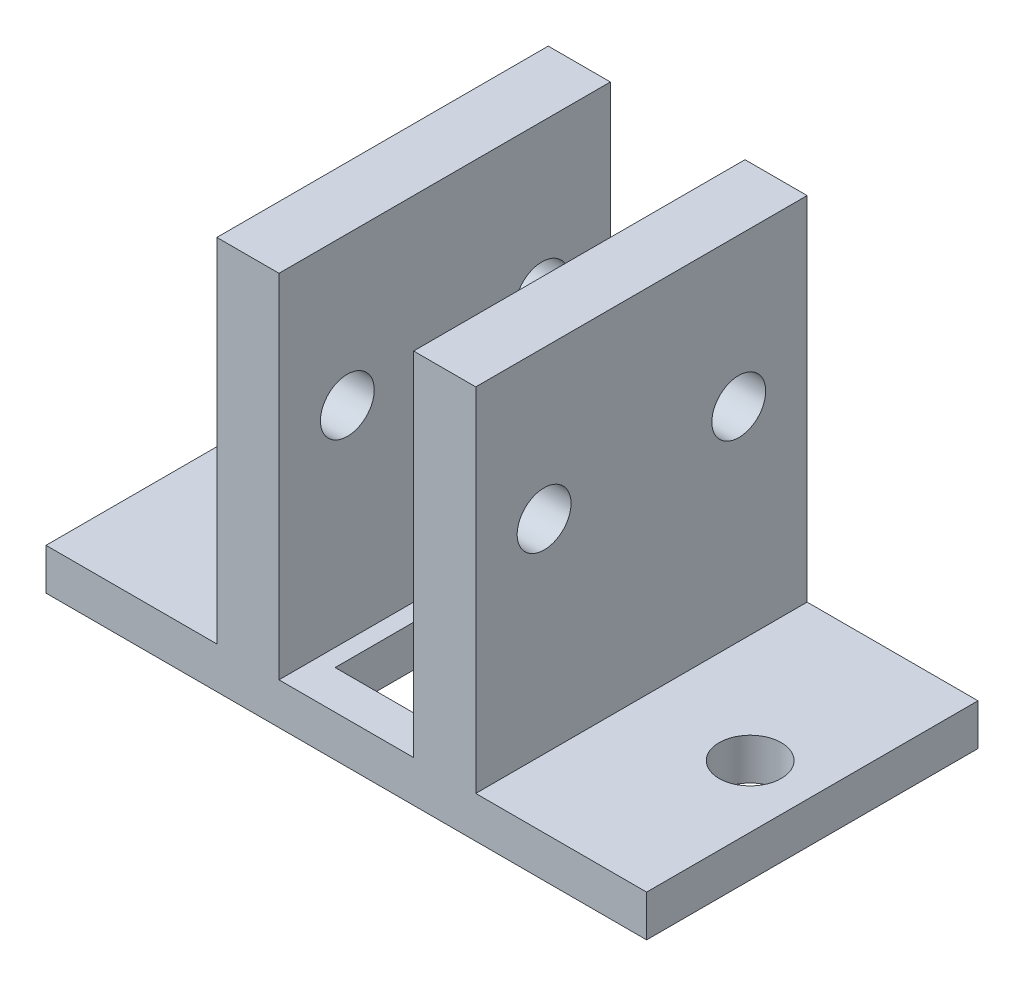
ISO-10303-21;
HEADER;
FILE_DESCRIPTION(('STEP AP214'),'2;1');
FILE_NAME('part.step','',(''),(''),'','','');
FILE_SCHEMA(('AUTOMOTIVE_DESIGN { 1 0 10303 214 1 1 1 1 }'));
ENDSEC;
DATA;
#1=APPLICATION_CONTEXT('core data for automotive mechanical design processes');
#2=APPLICATION_PROTOCOL_DEFINITION('international standard','automotive_design',2000,#1);
#3=PRODUCT_CONTEXT('',#1,'mechanical');
#4=PRODUCT('Part','Part','',(#3));
#5=PRODUCT_RELATED_PRODUCT_CATEGORY('part','',(#4));
#6=PRODUCT_DEFINITION_FORMATION('','',#4);
#7=PRODUCT_DEFINITION_CONTEXT('part definition',#1,'design');
#8=PRODUCT_DEFINITION('design','',#6,#7);
#9=PRODUCT_DEFINITION_SHAPE('','',#8);
#10=(LENGTH_UNIT() NAMED_UNIT(*) SI_UNIT(.MILLI.,.METRE.));
#11=(NAMED_UNIT(*) PLANE_ANGLE_UNIT() SI_UNIT($,.RADIAN.));
#12=(NAMED_UNIT(*) SI_UNIT($,.STERADIAN.) SOLID_ANGLE_UNIT());
#13=UNCERTAINTY_MEASURE_WITH_UNIT(LENGTH_MEASURE(1.E-05),#10,'distance_accuracy_value','');
#14=(GEOMETRIC_REPRESENTATION_CONTEXT(3) GLOBAL_UNCERTAINTY_ASSIGNED_CONTEXT((#13)) GLOBAL_UNIT_ASSIGNED_CONTEXT((#10,
#11,#12)) REPRESENTATION_CONTEXT('',''));
#15=CARTESIAN_POINT('',(0.,0.,0.));
#16=DIRECTION('',(0.,0.,1.));
#17=DIRECTION('',(1.,0.,0.));
#18=AXIS2_PLACEMENT_3D('',#15,#16,#17);
#19=CARTESIAN_POINT('',(0.,2.,0.));
#20=DIRECTION('',(0.,1.,0.));
#21=DIRECTION('',(0.,0.,1.));
#22=AXIS2_PLACEMENT_3D('',#19,#20,#21);
#23=PLANE('',#22);
#24=CARTESIAN_POINT('',(11.5,2.,0.));
#25=DIRECTION('',(0.,1.,0.));
#26=DIRECTION('',(0.,0.,1.));
#27=AXIS2_PLACEMENT_3D('',#24,#25,#26);
#28=CIRCLE('',#27,1.5);
#29=CARTESIAN_POINT('',(11.5,2.,1.5));
#30=VERTEX_POINT('',#29);
#31=EDGE_CURVE('E261',#30,#30,#28,.T.);
#32=ORIENTED_EDGE('',*,*,#31,.F.);
#33=EDGE_LOOP('',(#32));
#34=FACE_BOUND('',#33,.T.);
#35=DIRECTION('',(-1.,0.,0.));
#36=VECTOR('',#35,1.);
#37=CARTESIAN_POINT('',(14.5,2.,-8.));
#38=LINE('',#37,#36);
#39=CARTESIAN_POINT('',(14.5,2.,-8.));
#40=VERTEX_POINT('',#39);
#41=CARTESIAN_POINT('',(6.25000000000001,2.,-8.));
#42=VERTEX_POINT('',#41);
#43=EDGE_CURVE('E278',#40,#42,#38,.T.);
#44=ORIENTED_EDGE('',*,*,#43,.T.);
#45=DIRECTION('',(0.,0.,-1.));
#46=VECTOR('',#45,1.);
#47=CARTESIAN_POINT('',(6.25,2.,8.00000000000002));
#48=LINE('',#47,#46);
#49=CARTESIAN_POINT('',(6.25,2.,8.));
#50=VERTEX_POINT('',#49);
#51=EDGE_CURVE('E216',#50,#42,#48,.T.);
#52=ORIENTED_EDGE('',*,*,#51,.F.);
#53=DIRECTION('',(1.,0.,0.));
#54=VECTOR('',#53,1.);
#55=CARTESIAN_POINT('',(-14.5,2.,8.));
#56=LINE('',#55,#54);
#57=CARTESIAN_POINT('',(14.5,2.,8.));
#58=VERTEX_POINT('',#57);
#59=EDGE_CURVE('E270',#50,#58,#56,.T.);
#60=ORIENTED_EDGE('',*,*,#59,.T.);
#61=DIRECTION('',(0.,0.,-1.));
#62=VECTOR('',#61,1.);
#63=CARTESIAN_POINT('',(14.5,2.,8.));
#64=LINE('',#63,#62);
#65=EDGE_CURVE('E274',#58,#40,#64,.T.);
#66=ORIENTED_EDGE('',*,*,#65,.T.);
#67=EDGE_LOOP('',(#44,#52,#60,#66));
#68=FACE_BOUND('',#67,.T.);
#69=ADVANCED_FACE('F39',(#34,#68),#23,.T.);
#70=DIRECTION('',(0.,0.,1.));
#71=VECTOR('',#70,1.);
#72=CARTESIAN_POINT('',(-2.40923405016645,2.,6.13119178151331));
#73=LINE('',#72,#71);
#74=CARTESIAN_POINT('',(-2.40923405016645,2.,-6.13119178151331));
#75=VERTEX_POINT('',#74);
#76=CARTESIAN_POINT('',(-2.40923405016645,2.,6.13119178151331));
#77=VERTEX_POINT('',#76);
#78=EDGE_CURVE('E54',#75,#77,#73,.T.);
#79=ORIENTED_EDGE('',*,*,#78,.F.);
#80=DIRECTION('',(-1.,0.,0.));
#81=VECTOR('',#80,1.);
#82=CARTESIAN_POINT('',(2.40923405016645,2.,-6.13119178151331));
#83=LINE('',#82,#81);
#84=CARTESIAN_POINT('',(2.40923405016645,2.,-6.13119178151331));
#85=VERTEX_POINT('',#84);
#86=EDGE_CURVE('E171',#85,#75,#83,.T.);
#87=ORIENTED_EDGE('',*,*,#86,.F.);
#88=DIRECTION('',(0.,0.,-1.));
#89=VECTOR('',#88,1.);
#90=CARTESIAN_POINT('',(2.40923405016645,2.,6.13119178151331));
#91=LINE('',#90,#89);
#92=CARTESIAN_POINT('',(2.40923405016645,2.,6.13119178151331));
#93=VERTEX_POINT('',#92);
#94=EDGE_CURVE('E155',#93,#85,#91,.T.);
#95=ORIENTED_EDGE('',*,*,#94,.F.);
#96=DIRECTION('',(1.,0.,0.));
#97=VECTOR('',#96,1.);
#98=CARTESIAN_POINT('',(2.40923405016645,2.,6.13119178151331));
#99=LINE('',#98,#97);
#100=EDGE_CURVE('E164',#77,#93,#99,.T.);
#101=ORIENTED_EDGE('',*,*,#100,.F.);
#102=EDGE_LOOP('',(#79,#87,#95,#101));
#103=FACE_BOUND('',#102,.T.);
#104=CARTESIAN_POINT('',(-3.25,2.,8.));
#105=VERTEX_POINT('',#104);
#106=CARTESIAN_POINT('',(3.25,2.,8.));
#107=VERTEX_POINT('',#106);
#108=EDGE_CURVE('E275',#105,#107,#56,.T.);
#109=ORIENTED_EDGE('',*,*,#108,.T.);
#110=DIRECTION('',(0.,0.,1.));
#111=VECTOR('',#110,1.);
#112=CARTESIAN_POINT('',(3.25,2.,-8.00000000000002));
#113=LINE('',#112,#111);
#114=CARTESIAN_POINT('',(3.25,2.,-8.00000000000002));
#115=VERTEX_POINT('',#114);
#116=EDGE_CURVE('E213',#115,#107,#113,.T.);
#117=ORIENTED_EDGE('',*,*,#116,.F.);
#118=CARTESIAN_POINT('',(-3.25,2.,-8.));
#119=VERTEX_POINT('',#118);
#120=EDGE_CURVE('E281',#115,#119,#38,.T.);
#121=ORIENTED_EDGE('',*,*,#120,.T.);
#122=DIRECTION('',(0.,0.,-1.));
#123=VECTOR('',#122,1.);
#124=CARTESIAN_POINT('',(-3.25,2.,-8.00000000000002));
#125=LINE('',#124,#123);
#126=EDGE_CURVE('E232',#105,#119,#125,.T.);
#127=ORIENTED_EDGE('',*,*,#126,.F.);
#128=EDGE_LOOP('',(#109,#117,#121,#127));
#129=FACE_BOUND('',#128,.T.);
#130=ADVANCED_FACE('F168',(#103,#129),#23,.T.);
#131=DIRECTION('',(0.,0.,1.));
#132=VECTOR('',#131,1.);
#133=CARTESIAN_POINT('',(-6.25,2.,8.00000000000002));
#134=LINE('',#133,#132);
#135=CARTESIAN_POINT('',(-6.25,2.,-8.));
#136=VERTEX_POINT('',#135);
#137=CARTESIAN_POINT('',(-6.25,2.,8.00000000000002));
#138=VERTEX_POINT('',#137);
#139=EDGE_CURVE('E220',#136,#138,#134,.T.);
#140=ORIENTED_EDGE('',*,*,#139,.F.);
#141=CARTESIAN_POINT('',(-14.5,2.,-8.));
#142=VERTEX_POINT('',#141);
#143=EDGE_CURVE('E277',#136,#142,#38,.T.);
#144=ORIENTED_EDGE('',*,*,#143,.T.);
#145=DIRECTION('',(0.,0.,1.));
#146=VECTOR('',#145,1.);
#147=CARTESIAN_POINT('',(-14.5,2.,8.));
#148=LINE('',#147,#146);
#149=CARTESIAN_POINT('',(-14.5,2.,8.));
#150=VERTEX_POINT('',#149);
#151=EDGE_CURVE('E267',#142,#150,#148,.T.);
#152=ORIENTED_EDGE('',*,*,#151,.T.);
#153=EDGE_CURVE('E272',#150,#138,#56,.T.);
#154=ORIENTED_EDGE('',*,*,#153,.T.);
#155=EDGE_LOOP('',(#140,#144,#152,#154));
#156=FACE_BOUND('',#155,.T.);
#157=CARTESIAN_POINT('',(-11.5,2.,0.));
#158=DIRECTION('',(0.,1.,0.));
#159=DIRECTION('',(0.,0.,-1.));
#160=AXIS2_PLACEMENT_3D('',#157,#158,#159);
#161=CIRCLE('',#160,1.5);
#162=CARTESIAN_POINT('',(-11.5,2.,-1.5));
#163=VERTEX_POINT('',#162);
#164=EDGE_CURVE('E255',#163,#163,#161,.T.);
#165=ORIENTED_EDGE('',*,*,#164,.F.);
#166=EDGE_LOOP('',(#165));
#167=FACE_BOUND('',#166,.T.);
#168=ADVANCED_FACE('F331',(#156,#167),#23,.T.);
#169=CARTESIAN_POINT('',(0.,0.,0.));
#170=DIRECTION('',(0.,1.,0.));
#171=DIRECTION('',(0.,0.,1.));
#172=AXIS2_PLACEMENT_3D('',#169,#170,#171);
#173=PLANE('',#172);
#174=DIRECTION('',(-1.,0.,0.));
#175=VECTOR('',#174,1.);
#176=CARTESIAN_POINT('',(0.,0.,-6.13119178151331));
#177=LINE('',#176,#175);
#178=CARTESIAN_POINT('',(2.40923405016645,0.,-6.13119178151331));
#179=VERTEX_POINT('',#178);
#180=CARTESIAN_POINT('',(-2.40923405016645,0.,-6.13119178151331));
#181=VERTEX_POINT('',#180);
#182=EDGE_CURVE('E47',#179,#181,#177,.T.);
#183=ORIENTED_EDGE('',*,*,#182,.T.);
#184=DIRECTION('',(0.,0.,1.));
#185=VECTOR('',#184,1.);
#186=CARTESIAN_POINT('',(-2.40923405016645,0.,0.));
#187=LINE('',#186,#185);
#188=CARTESIAN_POINT('',(-2.40923405016645,0.,6.13119178151331));
#189=VERTEX_POINT('',#188);
#190=EDGE_CURVE('E11',#181,#189,#187,.T.);
#191=ORIENTED_EDGE('',*,*,#190,.T.);
#192=DIRECTION('',(1.,0.,0.));
#193=VECTOR('',#192,1.);
#194=CARTESIAN_POINT('',(0.,0.,6.13119178151331));
#195=LINE('',#194,#193);
#196=CARTESIAN_POINT('',(2.40923405016645,0.,6.13119178151331));
#197=VERTEX_POINT('',#196);
#198=EDGE_CURVE('E300',#189,#197,#195,.T.);
#199=ORIENTED_EDGE('',*,*,#198,.T.);
#200=DIRECTION('',(0.,0.,-1.));
#201=VECTOR('',#200,1.);
#202=CARTESIAN_POINT('',(2.40923405016645,0.,0.));
#203=LINE('',#202,#201);
#204=EDGE_CURVE('E158',#197,#179,#203,.T.);
#205=ORIENTED_EDGE('',*,*,#204,.T.);
#206=EDGE_LOOP('',(#183,#191,#199,#205));
#207=FACE_BOUND('',#206,.T.);
#208=DIRECTION('',(0.,0.,1.));
#209=VECTOR('',#208,1.);
#210=CARTESIAN_POINT('',(-14.5,0.,8.));
#211=LINE('',#210,#209);
#212=CARTESIAN_POINT('',(-14.5,0.,-8.));
#213=VERTEX_POINT('',#212);
#214=CARTESIAN_POINT('',(-14.5,0.,8.));
#215=VERTEX_POINT('',#214);
#216=EDGE_CURVE('E264',#213,#215,#211,.T.);
#217=ORIENTED_EDGE('',*,*,#216,.F.);
#218=DIRECTION('',(-1.,0.,0.));
#219=VECTOR('',#218,1.);
#220=CARTESIAN_POINT('',(14.5,0.,-8.));
#221=LINE('',#220,#219);
#222=CARTESIAN_POINT('',(14.5,0.,-8.));
#223=VERTEX_POINT('',#222);
#224=EDGE_CURVE('E271',#223,#213,#221,.T.);
#225=ORIENTED_EDGE('',*,*,#224,.F.);
#226=DIRECTION('',(0.,0.,-1.));
#227=VECTOR('',#226,1.);
#228=CARTESIAN_POINT('',(14.5,0.,8.));
#229=LINE('',#228,#227);
#230=CARTESIAN_POINT('',(14.5,0.,8.));
#231=VERTEX_POINT('',#230);
#232=EDGE_CURVE('E286',#231,#223,#229,.T.);
#233=ORIENTED_EDGE('',*,*,#232,.F.);
#234=DIRECTION('',(1.,0.,0.));
#235=VECTOR('',#234,1.);
#236=CARTESIAN_POINT('',(-14.5,0.,8.));
#237=LINE('',#236,#235);
#238=EDGE_CURVE('E284',#215,#231,#237,.T.);
#239=ORIENTED_EDGE('',*,*,#238,.F.);
#240=EDGE_LOOP('',(#217,#225,#233,#239));
#241=FACE_BOUND('',#240,.T.);
#242=CARTESIAN_POINT('',(11.5,0.,0.));
#243=DIRECTION('',(0.,1.,0.));
#244=DIRECTION('',(0.,0.,1.));
#245=AXIS2_PLACEMENT_3D('',#242,#243,#244);
#246=CIRCLE('',#245,1.5);
#247=CARTESIAN_POINT('',(11.5,0.,1.5));
#248=VERTEX_POINT('',#247);
#249=EDGE_CURVE('E258',#248,#248,#246,.T.);
#250=ORIENTED_EDGE('',*,*,#249,.T.);
#251=EDGE_LOOP('',(#250));
#252=FACE_BOUND('',#251,.T.);
#253=CARTESIAN_POINT('',(-11.5,0.,0.));
#254=DIRECTION('',(0.,1.,0.));
#255=DIRECTION('',(0.,0.,-1.));
#256=AXIS2_PLACEMENT_3D('',#253,#254,#255);
#257=CIRCLE('',#256,1.5);
#258=CARTESIAN_POINT('',(-11.5,0.,-1.5));
#259=VERTEX_POINT('',#258);
#260=EDGE_CURVE('E254',#259,#259,#257,.T.);
#261=ORIENTED_EDGE('',*,*,#260,.T.);
#262=EDGE_LOOP('',(#261));
#263=FACE_BOUND('',#262,.T.);
#264=ADVANCED_FACE('F308',(#207,#241,#252,#263),#173,.F.);
#265=CARTESIAN_POINT('',(-14.5,2.,8.));
#266=DIRECTION('',(1.,0.,0.));
#267=DIRECTION('',(0.,0.,-1.));
#268=AXIS2_PLACEMENT_3D('',#265,#266,#267);
#269=PLANE('',#268);
#270=ORIENTED_EDGE('',*,*,#216,.T.);
#271=DIRECTION('',(0.,-1.,0.));
#272=VECTOR('',#271,1.);
#273=CARTESIAN_POINT('',(-14.5,2.,8.));
#274=LINE('',#273,#272);
#275=EDGE_CURVE('E297',#150,#215,#274,.T.);
#276=ORIENTED_EDGE('',*,*,#275,.F.);
#277=ORIENTED_EDGE('',*,*,#151,.F.);
#278=DIRECTION('',(0.,-1.,0.));
#279=VECTOR('',#278,1.);
#280=CARTESIAN_POINT('',(-14.5,2.,-8.));
#281=LINE('',#280,#279);
#282=EDGE_CURVE('E280',#142,#213,#281,.T.);
#283=ORIENTED_EDGE('',*,*,#282,.T.);
#284=EDGE_LOOP('',(#270,#276,#277,#283));
#285=FACE_BOUND('',#284,.T.);
#286=ADVANCED_FACE('F41',(#285),#269,.F.);
#287=CARTESIAN_POINT('',(-14.5,2.,8.));
#288=DIRECTION('',(0.,0.,-1.));
#289=DIRECTION('',(-1.,0.,0.));
#290=AXIS2_PLACEMENT_3D('',#287,#288,#289);
#291=PLANE('',#290);
#292=ORIENTED_EDGE('',*,*,#238,.T.);
#293=DIRECTION('',(0.,-1.,0.));
#294=VECTOR('',#293,1.);
#295=CARTESIAN_POINT('',(14.5,2.,8.));
#296=LINE('',#295,#294);
#297=EDGE_CURVE('E294',#58,#231,#296,.T.);
#298=ORIENTED_EDGE('',*,*,#297,.F.);
#299=ORIENTED_EDGE('',*,*,#59,.F.);
#300=DIRECTION('',(0.,-1.,0.));
#301=VECTOR('',#300,1.);
#302=CARTESIAN_POINT('',(6.25,19.,8.00000000000002));
#303=LINE('',#302,#301);
#304=CARTESIAN_POINT('',(6.25,19.,8.00000000000002));
#305=VERTEX_POINT('',#304);
#306=EDGE_CURVE('E200',#305,#50,#303,.T.);
#307=ORIENTED_EDGE('',*,*,#306,.F.);
#308=DIRECTION('',(1.,0.,0.));
#309=VECTOR('',#308,1.);
#310=CARTESIAN_POINT('',(3.25,19.,8.));
#311=LINE('',#310,#309);
#312=CARTESIAN_POINT('',(3.25,19.,8.));
#313=VERTEX_POINT('',#312);
#314=EDGE_CURVE('E217',#313,#305,#311,.T.);
#315=ORIENTED_EDGE('',*,*,#314,.F.);
#316=DIRECTION('',(0.,-1.,0.));
#317=VECTOR('',#316,1.);
#318=CARTESIAN_POINT('',(3.25,19.,8.));
#319=LINE('',#318,#317);
#320=EDGE_CURVE('E209',#313,#107,#319,.T.);
#321=ORIENTED_EDGE('',*,*,#320,.T.);
#322=ORIENTED_EDGE('',*,*,#108,.F.);
#323=DIRECTION('',(0.,-1.,0.));
#324=VECTOR('',#323,1.);
#325=CARTESIAN_POINT('',(-3.25,19.,8.));
#326=LINE('',#325,#324);
#327=CARTESIAN_POINT('',(-3.25,19.,8.));
#328=VERTEX_POINT('',#327);
#329=EDGE_CURVE('E245',#328,#105,#326,.T.);
#330=ORIENTED_EDGE('',*,*,#329,.F.);
#331=DIRECTION('',(1.,0.,0.));
#332=VECTOR('',#331,1.);
#333=CARTESIAN_POINT('',(-3.25,19.,8.));
#334=LINE('',#333,#332);
#335=CARTESIAN_POINT('',(-6.25,19.,8.00000000000002));
#336=VERTEX_POINT('',#335);
#337=EDGE_CURVE('E234',#336,#328,#334,.T.);
#338=ORIENTED_EDGE('',*,*,#337,.F.);
#339=DIRECTION('',(0.,-1.,0.));
#340=VECTOR('',#339,1.);
#341=CARTESIAN_POINT('',(-6.25,19.,8.00000000000002));
#342=LINE('',#341,#340);
#343=EDGE_CURVE('E248',#336,#138,#342,.T.);
#344=ORIENTED_EDGE('',*,*,#343,.T.);
#345=ORIENTED_EDGE('',*,*,#153,.F.);
#346=ORIENTED_EDGE('',*,*,#275,.T.);
#347=EDGE_LOOP('',(#292,#298,#299,#307,#315,#321,#322,#330,#338,#344,#345,#346));
#348=FACE_BOUND('',#347,.T.);
#349=ADVANCED_FACE('F410',(#348),#291,.F.);
#350=CARTESIAN_POINT('',(14.5,2.,8.));
#351=DIRECTION('',(-1.,0.,0.));
#352=DIRECTION('',(0.,0.,1.));
#353=AXIS2_PLACEMENT_3D('',#350,#351,#352);
#354=PLANE('',#353);
#355=ORIENTED_EDGE('',*,*,#232,.T.);
#356=DIRECTION('',(0.,-1.,0.));
#357=VECTOR('',#356,1.);
#358=CARTESIAN_POINT('',(14.5,2.,-8.));
#359=LINE('',#358,#357);
#360=EDGE_CURVE('E291',#40,#223,#359,.T.);
#361=ORIENTED_EDGE('',*,*,#360,.F.);
#362=ORIENTED_EDGE('',*,*,#65,.F.);
#363=ORIENTED_EDGE('',*,*,#297,.T.);
#364=EDGE_LOOP('',(#355,#361,#362,#363));
#365=FACE_BOUND('',#364,.T.);
#366=ADVANCED_FACE('F436',(#365),#354,.F.);
#367=CARTESIAN_POINT('',(14.5,2.,-8.));
#368=DIRECTION('',(0.,0.,1.));
#369=DIRECTION('',(1.,0.,0.));
#370=AXIS2_PLACEMENT_3D('',#367,#368,#369);
#371=PLANE('',#370);
#372=ORIENTED_EDGE('',*,*,#224,.T.);
#373=ORIENTED_EDGE('',*,*,#282,.F.);
#374=ORIENTED_EDGE('',*,*,#143,.F.);
#375=DIRECTION('',(0.,-1.,0.));
#376=VECTOR('',#375,1.);
#377=CARTESIAN_POINT('',(-6.25,19.,-8.));
#378=LINE('',#377,#376);
#379=CARTESIAN_POINT('',(-6.25,19.,-8.));
#380=VERTEX_POINT('',#379);
#381=EDGE_CURVE('E251',#380,#136,#378,.T.);
#382=ORIENTED_EDGE('',*,*,#381,.F.);
#383=DIRECTION('',(-1.,0.,0.));
#384=VECTOR('',#383,1.);
#385=CARTESIAN_POINT('',(-6.25,19.,-8.));
#386=LINE('',#385,#384);
#387=CARTESIAN_POINT('',(-3.25,19.,-8.00000000000002));
#388=VERTEX_POINT('',#387);
#389=EDGE_CURVE('E228',#388,#380,#386,.T.);
#390=ORIENTED_EDGE('',*,*,#389,.F.);
#391=DIRECTION('',(0.,-1.,0.));
#392=VECTOR('',#391,1.);
#393=CARTESIAN_POINT('',(-3.25,19.,-8.00000000000002));
#394=LINE('',#393,#392);
#395=EDGE_CURVE('E238',#388,#119,#394,.T.);
#396=ORIENTED_EDGE('',*,*,#395,.T.);
#397=ORIENTED_EDGE('',*,*,#120,.F.);
#398=DIRECTION('',(0.,-1.,0.));
#399=VECTOR('',#398,1.);
#400=CARTESIAN_POINT('',(3.25,19.,-8.00000000000002));
#401=LINE('',#400,#399);
#402=CARTESIAN_POINT('',(3.25,19.,-8.00000000000002));
#403=VERTEX_POINT('',#402);
#404=EDGE_CURVE('E206',#403,#115,#401,.T.);
#405=ORIENTED_EDGE('',*,*,#404,.F.);
#406=DIRECTION('',(-1.,0.,0.));
#407=VECTOR('',#406,1.);
#408=CARTESIAN_POINT('',(6.25,19.,-8.));
#409=LINE('',#408,#407);
#410=CARTESIAN_POINT('',(6.25,19.,-8.));
#411=VERTEX_POINT('',#410);
#412=EDGE_CURVE('E222',#411,#403,#409,.T.);
#413=ORIENTED_EDGE('',*,*,#412,.F.);
#414=DIRECTION('',(0.,-1.,0.));
#415=VECTOR('',#414,1.);
#416=CARTESIAN_POINT('',(6.25,19.,-8.));
#417=LINE('',#416,#415);
#418=EDGE_CURVE('E203',#411,#42,#417,.T.);
#419=ORIENTED_EDGE('',*,*,#418,.T.);
#420=ORIENTED_EDGE('',*,*,#43,.F.);
#421=ORIENTED_EDGE('',*,*,#360,.T.);
#422=EDGE_LOOP('',(#372,#373,#374,#382,#390,#396,#397,#405,#413,#419,#420,#421));
#423=FACE_BOUND('',#422,.T.);
#424=ADVANCED_FACE('F363',(#423),#371,.F.);
#425=CARTESIAN_POINT('',(11.5,2.,0.));
#426=DIRECTION('',(0.,-1.,0.));
#427=DIRECTION('',(0.,0.,-1.));
#428=AXIS2_PLACEMENT_3D('',#425,#426,#427);
#429=CYLINDRICAL_SURFACE('',#428,1.5);
#430=ORIENTED_EDGE('',*,*,#31,.T.);
#431=EDGE_LOOP('',(#430));
#432=FACE_BOUND('',#431,.T.);
#433=ORIENTED_EDGE('',*,*,#249,.F.);
#434=EDGE_LOOP('',(#433));
#435=FACE_BOUND('',#434,.T.);
#436=ADVANCED_FACE('F352',(#432,#435),#429,.F.);
#437=CARTESIAN_POINT('',(-11.5,2.,0.));
#438=DIRECTION('',(0.,-1.,0.));
#439=DIRECTION('',(0.,0.,-1.));
#440=AXIS2_PLACEMENT_3D('',#437,#438,#439);
#441=CYLINDRICAL_SURFACE('',#440,1.5);
#442=ORIENTED_EDGE('',*,*,#164,.T.);
#443=EDGE_LOOP('',(#442));
#444=FACE_BOUND('',#443,.T.);
#445=ORIENTED_EDGE('',*,*,#260,.F.);
#446=EDGE_LOOP('',(#445));
#447=FACE_BOUND('',#446,.T.);
#448=ADVANCED_FACE('F349',(#444,#447),#441,.F.);
#449=CARTESIAN_POINT('',(-6.25,19.,8.00000000000002));
#450=DIRECTION('',(1.,0.,0.));
#451=DIRECTION('',(0.,0.,-1.));
#452=AXIS2_PLACEMENT_3D('',#449,#450,#451);
#453=PLANE('',#452);
#454=CARTESIAN_POINT('',(-6.25,11.8297146823603,4.70000000000003));
#455=DIRECTION('',(1.,0.,0.));
#456=DIRECTION('',(0.,0.,-1.));
#457=AXIS2_PLACEMENT_3D('',#454,#455,#456);
#458=CIRCLE('',#457,1.3);
#459=CARTESIAN_POINT('',(-6.25,11.8297146823603,3.40000000000002));
#460=VERTEX_POINT('',#459);
#461=EDGE_CURVE('E197',#460,#460,#458,.T.);
#462=ORIENTED_EDGE('',*,*,#461,.T.);
#463=EDGE_LOOP('',(#462));
#464=FACE_BOUND('',#463,.T.);
#465=CARTESIAN_POINT('',(-6.25,11.8297146823603,-4.69999999999998));
#466=DIRECTION('',(1.,0.,0.));
#467=DIRECTION('',(0.,0.,-1.));
#468=AXIS2_PLACEMENT_3D('',#465,#466,#467);
#469=CIRCLE('',#468,1.3);
#470=CARTESIAN_POINT('',(-6.25,11.8297146823603,-5.99999999999998));
#471=VERTEX_POINT('',#470);
#472=EDGE_CURVE('E190',#471,#471,#469,.T.);
#473=ORIENTED_EDGE('',*,*,#472,.T.);
#474=EDGE_LOOP('',(#473));
#475=FACE_BOUND('',#474,.T.);
#476=ORIENTED_EDGE('',*,*,#139,.T.);
#477=ORIENTED_EDGE('',*,*,#343,.F.);
#478=DIRECTION('',(0.,0.,1.));
#479=VECTOR('',#478,1.);
#480=CARTESIAN_POINT('',(-6.25,19.,8.00000000000002));
#481=LINE('',#480,#479);
#482=EDGE_CURVE('E231',#380,#336,#481,.T.);
#483=ORIENTED_EDGE('',*,*,#482,.F.);
#484=ORIENTED_EDGE('',*,*,#381,.T.);
#485=EDGE_LOOP('',(#476,#477,#483,#484));
#486=FACE_BOUND('',#485,.T.);
#487=ADVANCED_FACE('F351',(#464,#475,#486),#453,.F.);
#488=CARTESIAN_POINT('',(-3.25,19.,-8.00000000000002));
#489=DIRECTION('',(-1.,0.,0.));
#490=DIRECTION('',(0.,0.,1.));
#491=AXIS2_PLACEMENT_3D('',#488,#489,#490);
#492=PLANE('',#491);
#493=CARTESIAN_POINT('',(-3.25,11.8297146823603,4.70000000000003));
#494=DIRECTION('',(-1.,0.,0.));
#495=DIRECTION('',(0.,0.,1.));
#496=AXIS2_PLACEMENT_3D('',#493,#494,#495);
#497=CIRCLE('',#496,1.3);
#498=CARTESIAN_POINT('',(-3.25,11.8297146823603,6.00000000000003));
#499=VERTEX_POINT('',#498);
#500=EDGE_CURVE('E194',#499,#499,#497,.T.);
#501=ORIENTED_EDGE('',*,*,#500,.T.);
#502=EDGE_LOOP('',(#501));
#503=FACE_BOUND('',#502,.T.);
#504=CARTESIAN_POINT('',(-3.25,11.8297146823603,-4.69999999999998));
#505=DIRECTION('',(-1.,0.,0.));
#506=DIRECTION('',(0.,0.,1.));
#507=AXIS2_PLACEMENT_3D('',#504,#505,#506);
#508=CIRCLE('',#507,1.3);
#509=CARTESIAN_POINT('',(-3.25,11.8297146823603,-3.39999999999998));
#510=VERTEX_POINT('',#509);
#511=EDGE_CURVE('E187',#510,#510,#508,.T.);
#512=ORIENTED_EDGE('',*,*,#511,.T.);
#513=EDGE_LOOP('',(#512));
#514=FACE_BOUND('',#513,.T.);
#515=ORIENTED_EDGE('',*,*,#126,.T.);
#516=ORIENTED_EDGE('',*,*,#395,.F.);
#517=DIRECTION('',(0.,0.,-1.));
#518=VECTOR('',#517,1.);
#519=CARTESIAN_POINT('',(-3.25,19.,-8.00000000000002));
#520=LINE('',#519,#518);
#521=EDGE_CURVE('E236',#328,#388,#520,.T.);
#522=ORIENTED_EDGE('',*,*,#521,.F.);
#523=ORIENTED_EDGE('',*,*,#329,.T.);
#524=EDGE_LOOP('',(#515,#516,#522,#523));
#525=FACE_BOUND('',#524,.T.);
#526=ADVANCED_FACE('F360',(#503,#514,#525),#492,.F.);
#527=CARTESIAN_POINT('',(0.,19.,0.));
#528=DIRECTION('',(0.,-1.,0.));
#529=DIRECTION('',(0.,0.,-1.));
#530=AXIS2_PLACEMENT_3D('',#527,#528,#529);
#531=PLANE('',#530);
#532=ORIENTED_EDGE('',*,*,#389,.T.);
#533=ORIENTED_EDGE('',*,*,#482,.T.);
#534=ORIENTED_EDGE('',*,*,#337,.T.);
#535=ORIENTED_EDGE('',*,*,#521,.T.);
#536=EDGE_LOOP('',(#532,#533,#534,#535));
#537=FACE_BOUND('',#536,.T.);
#538=ADVANCED_FACE('F368',(#537),#531,.F.);
#539=CARTESIAN_POINT('',(6.25,19.,8.00000000000002));
#540=DIRECTION('',(-1.,0.,0.));
#541=DIRECTION('',(0.,0.,1.));
#542=AXIS2_PLACEMENT_3D('',#539,#540,#541);
#543=PLANE('',#542);
#544=CARTESIAN_POINT('',(6.25,11.8297146823603,4.70000000000002));
#545=DIRECTION('',(1.,0.,0.));
#546=DIRECTION('',(0.,0.,-1.));
#547=AXIS2_PLACEMENT_3D('',#544,#545,#546);
#548=CIRCLE('',#547,1.3);
#549=CARTESIAN_POINT('',(6.25,11.8297146823603,3.40000000000002));
#550=VERTEX_POINT('',#549);
#551=EDGE_CURVE('E181',#550,#550,#548,.T.);
#552=ORIENTED_EDGE('',*,*,#551,.F.);
#553=EDGE_LOOP('',(#552));
#554=FACE_BOUND('',#553,.T.);
#555=CARTESIAN_POINT('',(6.25,11.8297146823603,-4.69999999999998));
#556=DIRECTION('',(1.,0.,0.));
#557=DIRECTION('',(0.,0.,1.));
#558=AXIS2_PLACEMENT_3D('',#555,#556,#557);
#559=CIRCLE('',#558,1.3);
#560=CARTESIAN_POINT('',(6.25,11.8297146823603,-3.39999999999998));
#561=VERTEX_POINT('',#560);
#562=EDGE_CURVE('E178',#561,#561,#559,.T.);
#563=ORIENTED_EDGE('',*,*,#562,.F.);
#564=EDGE_LOOP('',(#563));
#565=FACE_BOUND('',#564,.T.);
#566=ORIENTED_EDGE('',*,*,#51,.T.);
#567=ORIENTED_EDGE('',*,*,#418,.F.);
#568=DIRECTION('',(0.,0.,-1.));
#569=VECTOR('',#568,1.);
#570=CARTESIAN_POINT('',(6.25,19.,8.00000000000002));
#571=LINE('',#570,#569);
#572=EDGE_CURVE('E224',#305,#411,#571,.T.);
#573=ORIENTED_EDGE('',*,*,#572,.F.);
#574=ORIENTED_EDGE('',*,*,#306,.T.);
#575=EDGE_LOOP('',(#566,#567,#573,#574));
#576=FACE_BOUND('',#575,.T.);
#577=ADVANCED_FACE('F372',(#554,#565,#576),#543,.F.);
#578=CARTESIAN_POINT('',(3.25,19.,-8.00000000000002));
#579=DIRECTION('',(1.,0.,0.));
#580=DIRECTION('',(0.,0.,-1.));
#581=AXIS2_PLACEMENT_3D('',#578,#579,#580);
#582=PLANE('',#581);
#583=CARTESIAN_POINT('',(3.25,11.8297146823603,4.70000000000002));
#584=DIRECTION('',(1.,0.,0.));
#585=DIRECTION('',(0.,0.,-1.));
#586=AXIS2_PLACEMENT_3D('',#583,#584,#585);
#587=CIRCLE('',#586,1.3);
#588=CARTESIAN_POINT('',(3.25,11.8297146823603,3.40000000000002));
#589=VERTEX_POINT('',#588);
#590=EDGE_CURVE('E193',#589,#589,#587,.T.);
#591=ORIENTED_EDGE('',*,*,#590,.T.);
#592=EDGE_LOOP('',(#591));
#593=FACE_BOUND('',#592,.T.);
#594=CARTESIAN_POINT('',(3.25,11.8297146823603,-4.69999999999998));
#595=DIRECTION('',(1.,0.,0.));
#596=DIRECTION('',(0.,0.,-1.));
#597=AXIS2_PLACEMENT_3D('',#594,#595,#596);
#598=CIRCLE('',#597,1.3);
#599=CARTESIAN_POINT('',(3.25,11.8297146823603,-5.99999999999998));
#600=VERTEX_POINT('',#599);
#601=EDGE_CURVE('E184',#600,#600,#598,.T.);
#602=ORIENTED_EDGE('',*,*,#601,.T.);
#603=EDGE_LOOP('',(#602));
#604=FACE_BOUND('',#603,.T.);
#605=ORIENTED_EDGE('',*,*,#116,.T.);
#606=ORIENTED_EDGE('',*,*,#320,.F.);
#607=DIRECTION('',(0.,0.,1.));
#608=VECTOR('',#607,1.);
#609=CARTESIAN_POINT('',(3.25,19.,-8.00000000000002));
#610=LINE('',#609,#608);
#611=EDGE_CURVE('E212',#403,#313,#610,.T.);
#612=ORIENTED_EDGE('',*,*,#611,.F.);
#613=ORIENTED_EDGE('',*,*,#404,.T.);
#614=EDGE_LOOP('',(#605,#606,#612,#613));
#615=FACE_BOUND('',#614,.T.);
#616=ADVANCED_FACE('F378',(#593,#604,#615),#582,.F.);
#617=CARTESIAN_POINT('',(0.,19.,0.));
#618=DIRECTION('',(0.,1.,0.));
#619=DIRECTION('',(0.,0.,1.));
#620=AXIS2_PLACEMENT_3D('',#617,#618,#619);
#621=PLANE('',#620);
#622=ORIENTED_EDGE('',*,*,#314,.T.);
#623=ORIENTED_EDGE('',*,*,#572,.T.);
#624=ORIENTED_EDGE('',*,*,#412,.T.);
#625=ORIENTED_EDGE('',*,*,#611,.T.);
#626=EDGE_LOOP('',(#622,#623,#624,#625));
#627=FACE_BOUND('',#626,.T.);
#628=ADVANCED_FACE('F374',(#627),#621,.T.);
#629=CARTESIAN_POINT('',(-10.75,11.8297146823603,-4.69999999999998));
#630=DIRECTION('',(1.,0.,0.));
#631=DIRECTION('',(0.,0.,-1.));
#632=AXIS2_PLACEMENT_3D('',#629,#630,#631);
#633=CYLINDRICAL_SURFACE('',#632,1.3);
#634=ORIENTED_EDGE('',*,*,#562,.T.);
#635=EDGE_LOOP('',(#634));
#636=FACE_BOUND('',#635,.T.);
#637=ORIENTED_EDGE('',*,*,#601,.F.);
#638=EDGE_LOOP('',(#637));
#639=FACE_BOUND('',#638,.T.);
#640=ADVANCED_FACE('F377',(#636,#639),#633,.F.);
#641=CARTESIAN_POINT('',(-10.75,11.8297146823603,4.70000000000003));
#642=DIRECTION('',(1.,0.,0.));
#643=DIRECTION('',(0.,0.,-1.));
#644=AXIS2_PLACEMENT_3D('',#641,#642,#643);
#645=CYLINDRICAL_SURFACE('',#644,1.3);
#646=ORIENTED_EDGE('',*,*,#551,.T.);
#647=EDGE_LOOP('',(#646));
#648=FACE_BOUND('',#647,.T.);
#649=ORIENTED_EDGE('',*,*,#590,.F.);
#650=EDGE_LOOP('',(#649));
#651=FACE_BOUND('',#650,.T.);
#652=ADVANCED_FACE('F326',(#648,#651),#645,.F.);
#653=ORIENTED_EDGE('',*,*,#511,.F.);
#654=EDGE_LOOP('',(#653));
#655=FACE_BOUND('',#654,.T.);
#656=ORIENTED_EDGE('',*,*,#472,.F.);
#657=EDGE_LOOP('',(#656));
#658=FACE_BOUND('',#657,.T.);
#659=ADVANCED_FACE('F323',(#655,#658),#633,.F.);
#660=ORIENTED_EDGE('',*,*,#500,.F.);
#661=EDGE_LOOP('',(#660));
#662=FACE_BOUND('',#661,.T.);
#663=ORIENTED_EDGE('',*,*,#461,.F.);
#664=EDGE_LOOP('',(#663));
#665=FACE_BOUND('',#664,.T.);
#666=ADVANCED_FACE('F315',(#662,#665),#645,.F.);
#667=CARTESIAN_POINT('',(-2.40923405016645,-8.,6.13119178151331));
#668=DIRECTION('',(-1.,0.,0.));
#669=DIRECTION('',(0.,0.,1.));
#670=AXIS2_PLACEMENT_3D('',#667,#668,#669);
#671=PLANE('',#670);
#672=DIRECTION('',(0.,1.,0.));
#673=VECTOR('',#672,1.);
#674=CARTESIAN_POINT('',(-2.40923405016645,-8.,-6.13119178151331));
#675=LINE('',#674,#673);
#676=EDGE_CURVE('E176',#181,#75,#675,.T.);
#677=ORIENTED_EDGE('',*,*,#676,.T.);
#678=ORIENTED_EDGE('',*,*,#78,.T.);
#679=DIRECTION('',(0.,1.,0.));
#680=VECTOR('',#679,1.);
#681=CARTESIAN_POINT('',(-2.40923405016645,-8.,6.13119178151331));
#682=LINE('',#681,#680);
#683=EDGE_CURVE('E161',#189,#77,#682,.T.);
#684=ORIENTED_EDGE('',*,*,#683,.F.);
#685=ORIENTED_EDGE('',*,*,#190,.F.);
#686=EDGE_LOOP('',(#677,#678,#684,#685));
#687=FACE_BOUND('',#686,.T.);
#688=ADVANCED_FACE('F313',(#687),#671,.F.);
#689=CARTESIAN_POINT('',(2.40923405016645,-8.,-6.13119178151331));
#690=DIRECTION('',(0.,0.,-1.));
#691=DIRECTION('',(-1.,0.,0.));
#692=AXIS2_PLACEMENT_3D('',#689,#690,#691);
#693=PLANE('',#692);
#694=DIRECTION('',(0.,1.,0.));
#695=VECTOR('',#694,1.);
#696=CARTESIAN_POINT('',(2.40923405016645,-8.,-6.13119178151331));
#697=LINE('',#696,#695);
#698=EDGE_CURVE('E160',#179,#85,#697,.T.);
#699=ORIENTED_EDGE('',*,*,#698,.T.);
#700=ORIENTED_EDGE('',*,*,#86,.T.);
#701=ORIENTED_EDGE('',*,*,#676,.F.);
#702=ORIENTED_EDGE('',*,*,#182,.F.);
#703=EDGE_LOOP('',(#699,#700,#701,#702));
#704=FACE_BOUND('',#703,.T.);
#705=ADVANCED_FACE('F312',(#704),#693,.F.);
#706=CARTESIAN_POINT('',(2.40923405016645,-8.,6.13119178151331));
#707=DIRECTION('',(1.,0.,0.));
#708=DIRECTION('',(0.,0.,-1.));
#709=AXIS2_PLACEMENT_3D('',#706,#707,#708);
#710=PLANE('',#709);
#711=DIRECTION('',(0.,1.,0.));
#712=VECTOR('',#711,1.);
#713=CARTESIAN_POINT('',(2.40923405016645,-8.,6.13119178151331));
#714=LINE('',#713,#712);
#715=EDGE_CURVE('E62',#197,#93,#714,.T.);
#716=ORIENTED_EDGE('',*,*,#715,.T.);
#717=ORIENTED_EDGE('',*,*,#94,.T.);
#718=ORIENTED_EDGE('',*,*,#698,.F.);
#719=ORIENTED_EDGE('',*,*,#204,.F.);
#720=EDGE_LOOP('',(#716,#717,#718,#719));
#721=FACE_BOUND('',#720,.T.);
#722=ADVANCED_FACE('F152',(#721),#710,.F.);
#723=CARTESIAN_POINT('',(2.40923405016645,-8.,6.13119178151331));
#724=DIRECTION('',(0.,0.,1.));
#725=DIRECTION('',(1.,0.,0.));
#726=AXIS2_PLACEMENT_3D('',#723,#724,#725);
#727=PLANE('',#726);
#728=ORIENTED_EDGE('',*,*,#683,.T.);
#729=ORIENTED_EDGE('',*,*,#100,.T.);
#730=ORIENTED_EDGE('',*,*,#715,.F.);
#731=ORIENTED_EDGE('',*,*,#198,.F.);
#732=EDGE_LOOP('',(#728,#729,#730,#731));
#733=FACE_BOUND('',#732,.T.);
#734=ADVANCED_FACE('F165',(#733),#727,.F.);
#735=CLOSED_SHELL('',(#69,#130,#168,#264,#286,#349,#366,#424,#436,#448,#487,#526,#538,#577,#616,
#628,#640,#652,#659,#666,#688,#705,#722,#734));
#736=MANIFOLD_SOLID_BREP('B2',#735);
#737=ADVANCED_BREP_SHAPE_REPRESENTATION('',(#18,#736),#14);
#738=SHAPE_DEFINITION_REPRESENTATION(#9,#737);
ENDSEC;
END-ISO-10303-21;
